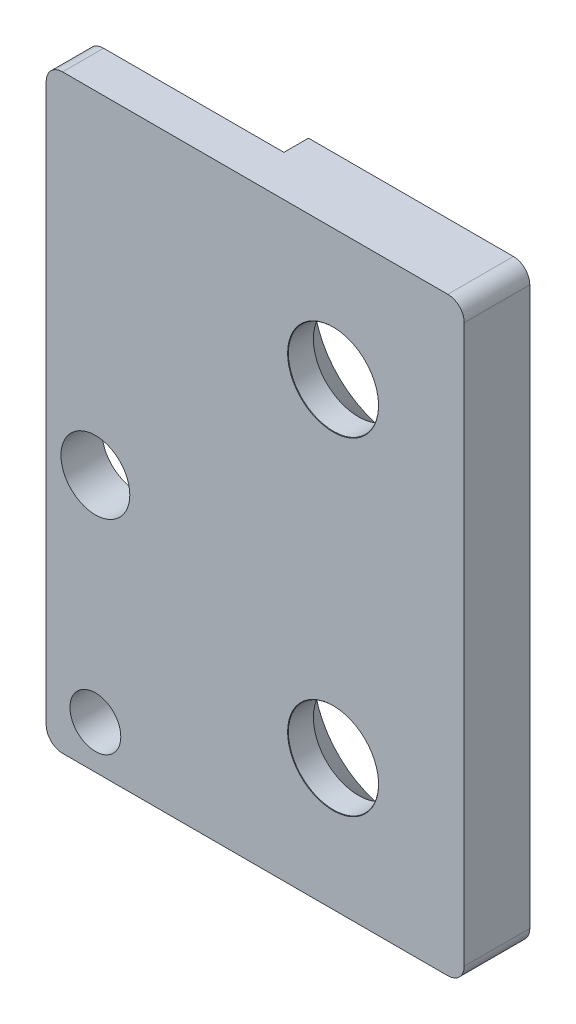
ISO-10303-21;
HEADER;
FILE_DESCRIPTION(('STEP AP214'),'2;1');
FILE_NAME('part.step','',(''),(''),'','','');
FILE_SCHEMA(('AUTOMOTIVE_DESIGN { 1 0 10303 214 1 1 1 1 }'));
ENDSEC;
DATA;
#1=APPLICATION_CONTEXT('core data for automotive mechanical design processes');
#2=APPLICATION_PROTOCOL_DEFINITION('international standard','automotive_design',2000,#1);
#3=PRODUCT_CONTEXT('',#1,'mechanical');
#4=PRODUCT('Part','Part','',(#3));
#5=PRODUCT_RELATED_PRODUCT_CATEGORY('part','',(#4));
#6=PRODUCT_DEFINITION_FORMATION('','',#4);
#7=PRODUCT_DEFINITION_CONTEXT('part definition',#1,'design');
#8=PRODUCT_DEFINITION('design','',#6,#7);
#9=PRODUCT_DEFINITION_SHAPE('','',#8);
#10=(LENGTH_UNIT() NAMED_UNIT(*) SI_UNIT(.MILLI.,.METRE.));
#11=(NAMED_UNIT(*) PLANE_ANGLE_UNIT() SI_UNIT($,.RADIAN.));
#12=(NAMED_UNIT(*) SI_UNIT($,.STERADIAN.) SOLID_ANGLE_UNIT());
#13=UNCERTAINTY_MEASURE_WITH_UNIT(LENGTH_MEASURE(1.E-05),#10,'distance_accuracy_value','');
#14=(GEOMETRIC_REPRESENTATION_CONTEXT(3) GLOBAL_UNCERTAINTY_ASSIGNED_CONTEXT((#13)) GLOBAL_UNIT_ASSIGNED_CONTEXT((#10,
#11,#12)) REPRESENTATION_CONTEXT('',''));
#15=CARTESIAN_POINT('',(0.,0.,0.));
#16=DIRECTION('',(0.,0.,1.));
#17=DIRECTION('',(1.,0.,0.));
#18=AXIS2_PLACEMENT_3D('',#15,#16,#17);
#19=CARTESIAN_POINT('',(-12.75,-18.001,1.5));
#20=DIRECTION('',(0.,0.,1.));
#21=DIRECTION('',(1.,0.,0.));
#22=AXIS2_PLACEMENT_3D('',#19,#20,#21);
#23=PLANE('',#22);
#24=CARTESIAN_POINT('',(-9.75,-2.30000000000001,1.5));
#25=DIRECTION('',(0.,0.,-1.));
#26=DIRECTION('',(-1.,0.,0.));
#27=AXIS2_PLACEMENT_3D('',#24,#25,#26);
#28=CIRCLE('',#27,2.10000000000001);
#29=CARTESIAN_POINT('',(-11.85,-2.30000000000001,1.5));
#30=VERTEX_POINT('',#29);
#31=EDGE_CURVE('E330',#30,#30,#28,.T.);
#32=ORIENTED_EDGE('',*,*,#31,.F.);
#33=EDGE_LOOP('',(#32));
#34=FACE_BOUND('',#33,.T.);
#35=DIRECTION('',(-1.,0.,0.));
#36=VECTOR('',#35,1.);
#37=CARTESIAN_POINT('',(-12.75,-18.,1.5));
#38=LINE('',#37,#36);
#39=CARTESIAN_POINT('',(-0.749999999999997,-18.,1.5));
#40=VERTEX_POINT('',#39);
#41=CARTESIAN_POINT('',(-11.75,-18.,1.5));
#42=VERTEX_POINT('',#41);
#43=EDGE_CURVE('E146',#40,#42,#38,.T.);
#44=ORIENTED_EDGE('',*,*,#43,.T.);
#45=CARTESIAN_POINT('',(-11.75,-17.,1.5));
#46=DIRECTION('',(0.,0.,1.));
#47=DIRECTION('',(1.,0.,0.));
#48=AXIS2_PLACEMENT_3D('',#45,#46,#47);
#49=CIRCLE('',#48,1.);
#50=CARTESIAN_POINT('',(-12.75,-17.,1.5));
#51=VERTEX_POINT('',#50);
#52=EDGE_CURVE('E173',#42,#51,#49,.F.);
#53=ORIENTED_EDGE('',*,*,#52,.T.);
#54=DIRECTION('',(0.,1.,0.));
#55=VECTOR('',#54,1.);
#56=CARTESIAN_POINT('',(-12.75,-18.001,1.5));
#57=LINE('',#56,#55);
#58=CARTESIAN_POINT('',(-12.75,17.,1.5));
#59=VERTEX_POINT('',#58);
#60=EDGE_CURVE('E137',#51,#59,#57,.T.);
#61=ORIENTED_EDGE('',*,*,#60,.T.);
#62=CARTESIAN_POINT('',(-11.75,17.,1.5));
#63=DIRECTION('',(0.,0.,1.));
#64=DIRECTION('',(1.,0.,0.));
#65=AXIS2_PLACEMENT_3D('',#62,#63,#64);
#66=CIRCLE('',#65,1.);
#67=CARTESIAN_POINT('',(-11.75,18.,1.5));
#68=VERTEX_POINT('',#67);
#69=EDGE_CURVE('E123',#59,#68,#66,.F.);
#70=ORIENTED_EDGE('',*,*,#69,.T.);
#71=DIRECTION('',(1.,0.,0.));
#72=VECTOR('',#71,1.);
#73=CARTESIAN_POINT('',(-12.75,18.,1.5));
#74=LINE('',#73,#72);
#75=CARTESIAN_POINT('',(-0.749999999999997,18.,1.5));
#76=VERTEX_POINT('',#75);
#77=EDGE_CURVE('E116',#68,#76,#74,.T.);
#78=ORIENTED_EDGE('',*,*,#77,.T.);
#79=DIRECTION('',(0.,1.,0.));
#80=VECTOR('',#79,1.);
#81=CARTESIAN_POINT('',(-0.749999999999997,-18.001,1.5));
#82=LINE('',#81,#80);
#83=EDGE_CURVE('E120',#40,#76,#82,.T.);
#84=ORIENTED_EDGE('',*,*,#83,.F.);
#85=EDGE_LOOP('',(#44,#53,#61,#70,#78,#84));
#86=FACE_BOUND('',#85,.T.);
#87=CARTESIAN_POINT('',(-9.75,-15.35,1.5));
#88=DIRECTION('',(0.,0.,-1.));
#89=DIRECTION('',(-1.,0.,0.));
#90=AXIS2_PLACEMENT_3D('',#87,#88,#89);
#91=CIRCLE('',#90,1.55);
#92=CARTESIAN_POINT('',(-11.3,-15.35,1.5));
#93=VERTEX_POINT('',#92);
#94=EDGE_CURVE('E324',#93,#93,#91,.T.);
#95=ORIENTED_EDGE('',*,*,#94,.F.);
#96=EDGE_LOOP('',(#95));
#97=FACE_BOUND('',#96,.T.);
#98=ADVANCED_FACE('F39',(#34,#86,#97),#23,.F.);
#99=CARTESIAN_POINT('',(0.,0.,0.));
#100=DIRECTION('',(0.,0.,1.));
#101=DIRECTION('',(1.,0.,0.));
#102=AXIS2_PLACEMENT_3D('',#99,#100,#101);
#103=PLANE('',#102);
#104=DIRECTION('',(-1.,0.,0.));
#105=VECTOR('',#104,1.);
#106=CARTESIAN_POINT('',(12.75,18.,0.));
#107=LINE('',#106,#105);
#108=CARTESIAN_POINT('',(11.75,18.,0.));
#109=VERTEX_POINT('',#108);
#110=CARTESIAN_POINT('',(-0.749999999999997,18.,0.));
#111=VERTEX_POINT('',#110);
#112=EDGE_CURVE('E141',#109,#111,#107,.T.);
#113=ORIENTED_EDGE('',*,*,#112,.F.);
#114=CARTESIAN_POINT('',(11.75,17.,0.));
#115=DIRECTION('',(0.,0.,1.));
#116=DIRECTION('',(1.,0.,0.));
#117=AXIS2_PLACEMENT_3D('',#114,#115,#116);
#118=CIRCLE('',#117,1.);
#119=CARTESIAN_POINT('',(12.75,17.,0.));
#120=VERTEX_POINT('',#119);
#121=EDGE_CURVE('E54',#109,#120,#118,.F.);
#122=ORIENTED_EDGE('',*,*,#121,.T.);
#123=DIRECTION('',(0.,1.,0.));
#124=VECTOR('',#123,1.);
#125=CARTESIAN_POINT('',(12.75,-18.,0.));
#126=LINE('',#125,#124);
#127=CARTESIAN_POINT('',(12.75,-17.,0.));
#128=VERTEX_POINT('',#127);
#129=EDGE_CURVE('E165',#128,#120,#126,.T.);
#130=ORIENTED_EDGE('',*,*,#129,.F.);
#131=CARTESIAN_POINT('',(11.75,-17.,0.));
#132=DIRECTION('',(0.,0.,1.));
#133=DIRECTION('',(1.,0.,0.));
#134=AXIS2_PLACEMENT_3D('',#131,#132,#133);
#135=CIRCLE('',#134,1.);
#136=CARTESIAN_POINT('',(11.75,-18.,0.));
#137=VERTEX_POINT('',#136);
#138=EDGE_CURVE('E62',#128,#137,#135,.F.);
#139=ORIENTED_EDGE('',*,*,#138,.T.);
#140=DIRECTION('',(1.,0.,0.));
#141=VECTOR('',#140,1.);
#142=CARTESIAN_POINT('',(12.75,-18.,0.));
#143=LINE('',#142,#141);
#144=CARTESIAN_POINT('',(-0.749999999999997,-18.,0.));
#145=VERTEX_POINT('',#144);
#146=EDGE_CURVE('E149',#145,#137,#143,.T.);
#147=ORIENTED_EDGE('',*,*,#146,.F.);
#148=DIRECTION('',(0.,1.,0.));
#149=VECTOR('',#148,1.);
#150=CARTESIAN_POINT('',(-0.749999999999997,-18.001,0.));
#151=LINE('',#150,#149);
#152=EDGE_CURVE('E136',#145,#111,#151,.T.);
#153=ORIENTED_EDGE('',*,*,#152,.T.);
#154=EDGE_LOOP('',(#113,#122,#130,#139,#147,#153));
#155=FACE_BOUND('',#154,.T.);
#156=CARTESIAN_POINT('',(4.75,-10.,0.));
#157=DIRECTION('',(0.,0.,-1.));
#158=DIRECTION('',(-1.,0.,0.));
#159=AXIS2_PLACEMENT_3D('',#156,#157,#158);
#160=CIRCLE('',#159,5.2);
#161=CARTESIAN_POINT('',(-0.449999999999999,-10.,0.));
#162=VERTEX_POINT('',#161);
#163=EDGE_CURVE('E303',#162,#162,#160,.T.);
#164=ORIENTED_EDGE('',*,*,#163,.F.);
#165=EDGE_LOOP('',(#164));
#166=FACE_BOUND('',#165,.T.);
#167=CARTESIAN_POINT('',(4.75,10.,0.));
#168=DIRECTION('',(0.,0.,-1.));
#169=DIRECTION('',(-1.,0.,0.));
#170=AXIS2_PLACEMENT_3D('',#167,#168,#169);
#171=CIRCLE('',#170,5.2);
#172=CARTESIAN_POINT('',(-0.449999999999999,10.,0.));
#173=VERTEX_POINT('',#172);
#174=EDGE_CURVE('E315',#173,#173,#171,.T.);
#175=ORIENTED_EDGE('',*,*,#174,.F.);
#176=EDGE_LOOP('',(#175));
#177=FACE_BOUND('',#176,.T.);
#178=ADVANCED_FACE('F198',(#155,#166,#177),#103,.F.);
#179=CARTESIAN_POINT('',(-12.75,-18.,4.));
#180=DIRECTION('',(1.,0.,0.));
#181=DIRECTION('',(0.,0.,-1.));
#182=AXIS2_PLACEMENT_3D('',#179,#180,#181);
#183=PLANE('',#182);
#184=ORIENTED_EDGE('',*,*,#60,.F.);
#185=DIRECTION('',(0.,0.,-1.));
#186=VECTOR('',#185,1.);
#187=CARTESIAN_POINT('',(-12.75,-17.,4.));
#188=LINE('',#187,#186);
#189=CARTESIAN_POINT('',(-12.75,-17.,4.));
#190=VERTEX_POINT('',#189);
#191=EDGE_CURVE('E178',#51,#190,#188,.F.);
#192=ORIENTED_EDGE('',*,*,#191,.T.);
#193=DIRECTION('',(0.,-1.,0.));
#194=VECTOR('',#193,1.);
#195=CARTESIAN_POINT('',(-12.75,-18.,4.));
#196=LINE('',#195,#194);
#197=CARTESIAN_POINT('',(-12.75,17.,4.));
#198=VERTEX_POINT('',#197);
#199=EDGE_CURVE('E150',#198,#190,#196,.T.);
#200=ORIENTED_EDGE('',*,*,#199,.F.);
#201=DIRECTION('',(0.,0.,-1.));
#202=VECTOR('',#201,1.);
#203=CARTESIAN_POINT('',(-12.75,17.,4.));
#204=LINE('',#203,#202);
#205=EDGE_CURVE('E175',#198,#59,#204,.T.);
#206=ORIENTED_EDGE('',*,*,#205,.T.);
#207=EDGE_LOOP('',(#184,#192,#200,#206));
#208=FACE_BOUND('',#207,.T.);
#209=ADVANCED_FACE('F214',(#208),#183,.F.);
#210=CARTESIAN_POINT('',(12.75,-18.,4.));
#211=DIRECTION('',(0.,1.,0.));
#212=DIRECTION('',(-1.,0.,0.));
#213=AXIS2_PLACEMENT_3D('',#210,#211,#212);
#214=PLANE('',#213);
#215=DIRECTION('',(1.,0.,0.));
#216=VECTOR('',#215,1.);
#217=CARTESIAN_POINT('',(12.75,-18.,4.));
#218=LINE('',#217,#216);
#219=CARTESIAN_POINT('',(-11.75,-18.,4.));
#220=VERTEX_POINT('',#219);
#221=CARTESIAN_POINT('',(11.75,-18.,4.));
#222=VERTEX_POINT('',#221);
#223=EDGE_CURVE('E153',#220,#222,#218,.T.);
#224=ORIENTED_EDGE('',*,*,#223,.F.);
#225=DIRECTION('',(0.,0.,-1.));
#226=VECTOR('',#225,1.);
#227=CARTESIAN_POINT('',(-11.75,-18.,4.));
#228=LINE('',#227,#226);
#229=EDGE_CURVE('E169',#220,#42,#228,.T.);
#230=ORIENTED_EDGE('',*,*,#229,.T.);
#231=ORIENTED_EDGE('',*,*,#43,.F.);
#232=DIRECTION('',(0.,0.,1.));
#233=VECTOR('',#232,1.);
#234=CARTESIAN_POINT('',(-0.749999999999997,-18.,0.));
#235=LINE('',#234,#233);
#236=EDGE_CURVE('E128',#145,#40,#235,.T.);
#237=ORIENTED_EDGE('',*,*,#236,.F.);
#238=ORIENTED_EDGE('',*,*,#146,.T.);
#239=DIRECTION('',(0.,0.,-1.));
#240=VECTOR('',#239,1.);
#241=CARTESIAN_POINT('',(11.75,-18.,4.));
#242=LINE('',#241,#240);
#243=EDGE_CURVE('E162',#137,#222,#242,.F.);
#244=ORIENTED_EDGE('',*,*,#243,.T.);
#245=EDGE_LOOP('',(#224,#230,#231,#237,#238,#244));
#246=FACE_BOUND('',#245,.T.);
#247=ADVANCED_FACE('F203',(#246),#214,.F.);
#248=CARTESIAN_POINT('',(12.75,-18.,4.));
#249=DIRECTION('',(-1.,0.,0.));
#250=DIRECTION('',(0.,0.,1.));
#251=AXIS2_PLACEMENT_3D('',#248,#249,#250);
#252=PLANE('',#251);
#253=ORIENTED_EDGE('',*,*,#129,.T.);
#254=DIRECTION('',(0.,0.,-1.));
#255=VECTOR('',#254,1.);
#256=CARTESIAN_POINT('',(12.75,17.,4.));
#257=LINE('',#256,#255);
#258=CARTESIAN_POINT('',(12.75,17.,4.));
#259=VERTEX_POINT('',#258);
#260=EDGE_CURVE('E11',#120,#259,#257,.F.);
#261=ORIENTED_EDGE('',*,*,#260,.T.);
#262=DIRECTION('',(0.,1.,0.));
#263=VECTOR('',#262,1.);
#264=CARTESIAN_POINT('',(12.75,-18.,4.));
#265=LINE('',#264,#263);
#266=CARTESIAN_POINT('',(12.75,-17.,4.));
#267=VERTEX_POINT('',#266);
#268=EDGE_CURVE('E156',#267,#259,#265,.T.);
#269=ORIENTED_EDGE('',*,*,#268,.F.);
#270=DIRECTION('',(0.,0.,-1.));
#271=VECTOR('',#270,1.);
#272=CARTESIAN_POINT('',(12.75,-17.,4.));
#273=LINE('',#272,#271);
#274=EDGE_CURVE('E47',#267,#128,#273,.T.);
#275=ORIENTED_EDGE('',*,*,#274,.T.);
#276=EDGE_LOOP('',(#253,#261,#269,#275));
#277=FACE_BOUND('',#276,.T.);
#278=ADVANCED_FACE('F195',(#277),#252,.F.);
#279=CARTESIAN_POINT('',(12.75,18.,4.));
#280=DIRECTION('',(0.,-1.,0.));
#281=DIRECTION('',(0.,0.,-1.));
#282=AXIS2_PLACEMENT_3D('',#279,#280,#281);
#283=PLANE('',#282);
#284=ORIENTED_EDGE('',*,*,#77,.F.);
#285=DIRECTION('',(0.,0.,-1.));
#286=VECTOR('',#285,1.);
#287=CARTESIAN_POINT('',(-11.75,18.,4.));
#288=LINE('',#287,#286);
#289=CARTESIAN_POINT('',(-11.75,18.,4.));
#290=VERTEX_POINT('',#289);
#291=EDGE_CURVE('E190',#68,#290,#288,.F.);
#292=ORIENTED_EDGE('',*,*,#291,.T.);
#293=DIRECTION('',(-1.,0.,0.));
#294=VECTOR('',#293,1.);
#295=CARTESIAN_POINT('',(12.75,18.,4.));
#296=LINE('',#295,#294);
#297=CARTESIAN_POINT('',(11.75,18.,4.));
#298=VERTEX_POINT('',#297);
#299=EDGE_CURVE('E159',#298,#290,#296,.T.);
#300=ORIENTED_EDGE('',*,*,#299,.F.);
#301=DIRECTION('',(0.,0.,-1.));
#302=VECTOR('',#301,1.);
#303=CARTESIAN_POINT('',(11.75,18.,4.));
#304=LINE('',#303,#302);
#305=EDGE_CURVE('E188',#298,#109,#304,.T.);
#306=ORIENTED_EDGE('',*,*,#305,.T.);
#307=ORIENTED_EDGE('',*,*,#112,.T.);
#308=DIRECTION('',(0.,0.,-1.));
#309=VECTOR('',#308,1.);
#310=CARTESIAN_POINT('',(-0.749999999999997,18.,0.));
#311=LINE('',#310,#309);
#312=EDGE_CURVE('E127',#76,#111,#311,.T.);
#313=ORIENTED_EDGE('',*,*,#312,.F.);
#314=EDGE_LOOP('',(#284,#292,#300,#306,#307,#313));
#315=FACE_BOUND('',#314,.T.);
#316=ADVANCED_FACE('F139',(#315),#283,.F.);
#317=CARTESIAN_POINT('',(0.,0.,4.));
#318=DIRECTION('',(0.,0.,1.));
#319=DIRECTION('',(1.,0.,0.));
#320=AXIS2_PLACEMENT_3D('',#317,#318,#319);
#321=PLANE('',#320);
#322=CARTESIAN_POINT('',(-9.75,-2.30000000000001,4.));
#323=DIRECTION('',(0.,0.,1.));
#324=DIRECTION('',(1.,0.,0.));
#325=AXIS2_PLACEMENT_3D('',#322,#323,#324);
#326=CIRCLE('',#325,2.10000000000001);
#327=CARTESIAN_POINT('',(-7.64999999999999,-2.30000000000001,4.));
#328=VERTEX_POINT('',#327);
#329=EDGE_CURVE('E327',#328,#328,#326,.T.);
#330=ORIENTED_EDGE('',*,*,#329,.F.);
#331=EDGE_LOOP('',(#330));
#332=FACE_BOUND('',#331,.T.);
#333=CARTESIAN_POINT('',(-9.75,-15.35,4.));
#334=DIRECTION('',(0.,0.,1.));
#335=DIRECTION('',(1.,0.,0.));
#336=AXIS2_PLACEMENT_3D('',#333,#334,#335);
#337=CIRCLE('',#336,1.55);
#338=CARTESIAN_POINT('',(-8.2,-15.35,4.));
#339=VERTEX_POINT('',#338);
#340=EDGE_CURVE('E321',#339,#339,#337,.T.);
#341=ORIENTED_EDGE('',*,*,#340,.F.);
#342=EDGE_LOOP('',(#341));
#343=FACE_BOUND('',#342,.T.);
#344=CARTESIAN_POINT('',(4.75,10.,4.));
#345=DIRECTION('',(0.,0.,-1.));
#346=DIRECTION('',(-1.,0.,0.));
#347=AXIS2_PLACEMENT_3D('',#344,#345,#346);
#348=CIRCLE('',#347,2.775);
#349=CARTESIAN_POINT('',(1.975,10.,4.));
#350=VERTEX_POINT('',#349);
#351=EDGE_CURVE('E318',#350,#350,#348,.T.);
#352=ORIENTED_EDGE('',*,*,#351,.T.);
#353=EDGE_LOOP('',(#352));
#354=FACE_BOUND('',#353,.T.);
#355=CARTESIAN_POINT('',(4.75,-10.,4.));
#356=DIRECTION('',(0.,0.,-1.));
#357=DIRECTION('',(-1.,0.,0.));
#358=AXIS2_PLACEMENT_3D('',#355,#356,#357);
#359=CIRCLE('',#358,2.775);
#360=CARTESIAN_POINT('',(1.975,-10.,4.));
#361=VERTEX_POINT('',#360);
#362=EDGE_CURVE('E296',#361,#361,#359,.T.);
#363=ORIENTED_EDGE('',*,*,#362,.T.);
#364=EDGE_LOOP('',(#363));
#365=FACE_BOUND('',#364,.T.);
#366=ORIENTED_EDGE('',*,*,#199,.T.);
#367=CARTESIAN_POINT('',(-11.75,-17.,4.));
#368=DIRECTION('',(0.,0.,1.));
#369=DIRECTION('',(1.,0.,0.));
#370=AXIS2_PLACEMENT_3D('',#367,#368,#369);
#371=CIRCLE('',#370,1.);
#372=EDGE_CURVE('E186',#190,#220,#371,.T.);
#373=ORIENTED_EDGE('',*,*,#372,.T.);
#374=ORIENTED_EDGE('',*,*,#223,.T.);
#375=CARTESIAN_POINT('',(11.75,-17.,4.));
#376=DIRECTION('',(0.,0.,1.));
#377=DIRECTION('',(1.,0.,0.));
#378=AXIS2_PLACEMENT_3D('',#375,#376,#377);
#379=CIRCLE('',#378,1.);
#380=EDGE_CURVE('E180',#222,#267,#379,.T.);
#381=ORIENTED_EDGE('',*,*,#380,.T.);
#382=ORIENTED_EDGE('',*,*,#268,.T.);
#383=CARTESIAN_POINT('',(11.75,17.,4.));
#384=DIRECTION('',(0.,0.,1.));
#385=DIRECTION('',(1.,0.,0.));
#386=AXIS2_PLACEMENT_3D('',#383,#384,#385);
#387=CIRCLE('',#386,1.);
#388=EDGE_CURVE('E182',#259,#298,#387,.T.);
#389=ORIENTED_EDGE('',*,*,#388,.T.);
#390=ORIENTED_EDGE('',*,*,#299,.T.);
#391=CARTESIAN_POINT('',(-11.75,17.,4.));
#392=DIRECTION('',(0.,0.,1.));
#393=DIRECTION('',(1.,0.,0.));
#394=AXIS2_PLACEMENT_3D('',#391,#392,#393);
#395=CIRCLE('',#394,1.);
#396=EDGE_CURVE('E184',#290,#198,#395,.T.);
#397=ORIENTED_EDGE('',*,*,#396,.T.);
#398=EDGE_LOOP('',(#366,#373,#374,#381,#382,#389,#390,#397));
#399=FACE_BOUND('',#398,.T.);
#400=ADVANCED_FACE('F205',(#332,#343,#354,#365,#399),#321,.T.);
#401=CARTESIAN_POINT('',(-0.749999999999997,-18.001,0.));
#402=DIRECTION('',(1.,0.,0.));
#403=DIRECTION('',(0.,0.,-1.));
#404=AXIS2_PLACEMENT_3D('',#401,#402,#403);
#405=PLANE('',#404);
#406=ORIENTED_EDGE('',*,*,#236,.T.);
#407=ORIENTED_EDGE('',*,*,#83,.T.);
#408=ORIENTED_EDGE('',*,*,#312,.T.);
#409=ORIENTED_EDGE('',*,*,#152,.F.);
#410=EDGE_LOOP('',(#406,#407,#408,#409));
#411=FACE_BOUND('',#410,.T.);
#412=ADVANCED_FACE('F132',(#411),#405,.F.);
#413=CARTESIAN_POINT('',(4.75,-10.,3.975));
#414=DIRECTION('',(0.,0.,1.));
#415=DIRECTION('',(1.,0.,0.));
#416=AXIS2_PLACEMENT_3D('',#413,#414,#415);
#417=CONICAL_SURFACE('',#416,2.75,0.785398163397448);
#418=ORIENTED_EDGE('',*,*,#362,.F.);
#419=EDGE_LOOP('',(#418));
#420=FACE_BOUND('',#419,.T.);
#421=CARTESIAN_POINT('',(4.75,-10.,3.975));
#422=DIRECTION('',(0.,0.,-1.));
#423=DIRECTION('',(-1.,0.,0.));
#424=AXIS2_PLACEMENT_3D('',#421,#422,#423);
#425=CIRCLE('',#424,2.75);
#426=CARTESIAN_POINT('',(2.,-10.,3.975));
#427=VERTEX_POINT('',#426);
#428=EDGE_CURVE('E299',#427,#427,#425,.T.);
#429=ORIENTED_EDGE('',*,*,#428,.T.);
#430=EDGE_LOOP('',(#429));
#431=FACE_BOUND('',#430,.T.);
#432=ADVANCED_FACE('F286',(#420,#431),#417,.F.);
#433=CARTESIAN_POINT('',(4.75,-10.,0.));
#434=DIRECTION('',(0.,0.,-1.));
#435=DIRECTION('',(-1.,0.,0.));
#436=AXIS2_PLACEMENT_3D('',#433,#434,#435);
#437=CYLINDRICAL_SURFACE('',#436,2.75);
#438=ORIENTED_EDGE('',*,*,#428,.F.);
#439=EDGE_LOOP('',(#438));
#440=FACE_BOUND('',#439,.T.);
#441=CARTESIAN_POINT('',(4.75,-10.,2.45));
#442=DIRECTION('',(0.,0.,-1.));
#443=DIRECTION('',(-1.,0.,0.));
#444=AXIS2_PLACEMENT_3D('',#441,#442,#443);
#445=CIRCLE('',#444,2.75);
#446=CARTESIAN_POINT('',(2.,-10.,2.45));
#447=VERTEX_POINT('',#446);
#448=EDGE_CURVE('E300',#447,#447,#445,.T.);
#449=ORIENTED_EDGE('',*,*,#448,.T.);
#450=EDGE_LOOP('',(#449));
#451=FACE_BOUND('',#450,.T.);
#452=ADVANCED_FACE('F283',(#440,#451),#437,.F.);
#453=CARTESIAN_POINT('',(4.75,-10.,0.));
#454=DIRECTION('',(0.,0.,-1.));
#455=DIRECTION('',(-1.,0.,0.));
#456=AXIS2_PLACEMENT_3D('',#453,#454,#455);
#457=CONICAL_SURFACE('',#456,5.2,0.785398163397448);
#458=ORIENTED_EDGE('',*,*,#448,.F.);
#459=EDGE_LOOP('',(#458));
#460=FACE_BOUND('',#459,.T.);
#461=ORIENTED_EDGE('',*,*,#163,.T.);
#462=EDGE_LOOP('',(#461));
#463=FACE_BOUND('',#462,.T.);
#464=ADVANCED_FACE('F279',(#460,#463),#457,.F.);
#465=CARTESIAN_POINT('',(4.75,10.,3.975));
#466=DIRECTION('',(0.,0.,1.));
#467=DIRECTION('',(1.,0.,0.));
#468=AXIS2_PLACEMENT_3D('',#465,#466,#467);
#469=CONICAL_SURFACE('',#468,2.75,0.785398163397448);
#470=ORIENTED_EDGE('',*,*,#351,.F.);
#471=EDGE_LOOP('',(#470));
#472=FACE_BOUND('',#471,.T.);
#473=CARTESIAN_POINT('',(4.75,10.,3.975));
#474=DIRECTION('',(0.,0.,-1.));
#475=DIRECTION('',(-1.,0.,0.));
#476=AXIS2_PLACEMENT_3D('',#473,#474,#475);
#477=CIRCLE('',#476,2.75);
#478=CARTESIAN_POINT('',(2.,10.,3.975));
#479=VERTEX_POINT('',#478);
#480=EDGE_CURVE('E309',#479,#479,#477,.T.);
#481=ORIENTED_EDGE('',*,*,#480,.T.);
#482=EDGE_LOOP('',(#481));
#483=FACE_BOUND('',#482,.T.);
#484=ADVANCED_FACE('F275',(#472,#483),#469,.F.);
#485=CARTESIAN_POINT('',(4.75,10.,0.));
#486=DIRECTION('',(0.,0.,-1.));
#487=DIRECTION('',(-1.,0.,0.));
#488=AXIS2_PLACEMENT_3D('',#485,#486,#487);
#489=CYLINDRICAL_SURFACE('',#488,2.75);
#490=ORIENTED_EDGE('',*,*,#480,.F.);
#491=EDGE_LOOP('',(#490));
#492=FACE_BOUND('',#491,.T.);
#493=CARTESIAN_POINT('',(4.75,10.,2.45));
#494=DIRECTION('',(0.,0.,-1.));
#495=DIRECTION('',(-1.,0.,0.));
#496=AXIS2_PLACEMENT_3D('',#493,#494,#495);
#497=CIRCLE('',#496,2.75);
#498=CARTESIAN_POINT('',(2.,10.,2.45));
#499=VERTEX_POINT('',#498);
#500=EDGE_CURVE('E312',#499,#499,#497,.T.);
#501=ORIENTED_EDGE('',*,*,#500,.T.);
#502=EDGE_LOOP('',(#501));
#503=FACE_BOUND('',#502,.T.);
#504=ADVANCED_FACE('F271',(#492,#503),#489,.F.);
#505=CARTESIAN_POINT('',(4.75,10.,0.));
#506=DIRECTION('',(0.,0.,-1.));
#507=DIRECTION('',(-1.,0.,0.));
#508=AXIS2_PLACEMENT_3D('',#505,#506,#507);
#509=CONICAL_SURFACE('',#508,5.2,0.785398163397448);
#510=ORIENTED_EDGE('',*,*,#500,.F.);
#511=EDGE_LOOP('',(#510));
#512=FACE_BOUND('',#511,.T.);
#513=ORIENTED_EDGE('',*,*,#174,.T.);
#514=EDGE_LOOP('',(#513));
#515=FACE_BOUND('',#514,.T.);
#516=ADVANCED_FACE('F263',(#512,#515),#509,.F.);
#517=CARTESIAN_POINT('',(-9.75,-15.35,1.5));
#518=DIRECTION('',(0.,0.,-1.));
#519=DIRECTION('',(-1.,0.,0.));
#520=AXIS2_PLACEMENT_3D('',#517,#518,#519);
#521=CYLINDRICAL_SURFACE('',#520,1.55);
#522=ORIENTED_EDGE('',*,*,#94,.T.);
#523=EDGE_LOOP('',(#522));
#524=FACE_BOUND('',#523,.T.);
#525=ORIENTED_EDGE('',*,*,#340,.T.);
#526=EDGE_LOOP('',(#525));
#527=FACE_BOUND('',#526,.T.);
#528=ADVANCED_FACE('F257',(#524,#527),#521,.F.);
#529=CARTESIAN_POINT('',(-9.75,-2.30000000000001,1.5));
#530=DIRECTION('',(0.,0.,-1.));
#531=DIRECTION('',(-1.,0.,0.));
#532=AXIS2_PLACEMENT_3D('',#529,#530,#531);
#533=CYLINDRICAL_SURFACE('',#532,2.10000000000001);
#534=ORIENTED_EDGE('',*,*,#31,.T.);
#535=EDGE_LOOP('',(#534));
#536=FACE_BOUND('',#535,.T.);
#537=ORIENTED_EDGE('',*,*,#329,.T.);
#538=EDGE_LOOP('',(#537));
#539=FACE_BOUND('',#538,.T.);
#540=ADVANCED_FACE('F253',(#536,#539),#533,.F.);
#541=CARTESIAN_POINT('',(-11.75,-17.,4.));
#542=DIRECTION('',(0.,0.,-1.));
#543=DIRECTION('',(-1.,0.,0.));
#544=AXIS2_PLACEMENT_3D('',#541,#542,#543);
#545=CYLINDRICAL_SURFACE('',#544,1.);
#546=ORIENTED_EDGE('',*,*,#372,.F.);
#547=ORIENTED_EDGE('',*,*,#191,.F.);
#548=ORIENTED_EDGE('',*,*,#52,.F.);
#549=ORIENTED_EDGE('',*,*,#229,.F.);
#550=EDGE_LOOP('',(#546,#547,#548,#549));
#551=FACE_BOUND('',#550,.T.);
#552=ADVANCED_FACE('F210',(#551),#545,.T.);
#553=CARTESIAN_POINT('',(-11.75,17.,4.));
#554=DIRECTION('',(0.,0.,-1.));
#555=DIRECTION('',(-1.,0.,0.));
#556=AXIS2_PLACEMENT_3D('',#553,#554,#555);
#557=CYLINDRICAL_SURFACE('',#556,1.);
#558=ORIENTED_EDGE('',*,*,#396,.F.);
#559=ORIENTED_EDGE('',*,*,#291,.F.);
#560=ORIENTED_EDGE('',*,*,#69,.F.);
#561=ORIENTED_EDGE('',*,*,#205,.F.);
#562=EDGE_LOOP('',(#558,#559,#560,#561));
#563=FACE_BOUND('',#562,.T.);
#564=ADVANCED_FACE('F219',(#563),#557,.T.);
#565=CARTESIAN_POINT('',(11.75,17.,4.));
#566=DIRECTION('',(0.,0.,-1.));
#567=DIRECTION('',(-1.,0.,0.));
#568=AXIS2_PLACEMENT_3D('',#565,#566,#567);
#569=CYLINDRICAL_SURFACE('',#568,1.);
#570=ORIENTED_EDGE('',*,*,#388,.F.);
#571=ORIENTED_EDGE('',*,*,#260,.F.);
#572=ORIENTED_EDGE('',*,*,#121,.F.);
#573=ORIENTED_EDGE('',*,*,#305,.F.);
#574=EDGE_LOOP('',(#570,#571,#572,#573));
#575=FACE_BOUND('',#574,.T.);
#576=ADVANCED_FACE('F223',(#575),#569,.T.);
#577=CARTESIAN_POINT('',(11.75,-17.,4.));
#578=DIRECTION('',(0.,0.,-1.));
#579=DIRECTION('',(-1.,0.,0.));
#580=AXIS2_PLACEMENT_3D('',#577,#578,#579);
#581=CYLINDRICAL_SURFACE('',#580,1.);
#582=ORIENTED_EDGE('',*,*,#380,.F.);
#583=ORIENTED_EDGE('',*,*,#243,.F.);
#584=ORIENTED_EDGE('',*,*,#138,.F.);
#585=ORIENTED_EDGE('',*,*,#274,.F.);
#586=EDGE_LOOP('',(#582,#583,#584,#585));
#587=FACE_BOUND('',#586,.T.);
#588=ADVANCED_FACE('F41',(#587),#581,.T.);
#589=CLOSED_SHELL('',(#98,#178,#209,#247,#278,#316,#400,#412,#432,#452,#464,#484,#504,#516,#528,
#540,#552,#564,#576,#588));
#590=MANIFOLD_SOLID_BREP('B2',#589);
#591=ADVANCED_BREP_SHAPE_REPRESENTATION('',(#18,#590),#14);
#592=SHAPE_DEFINITION_REPRESENTATION(#9,#591);
ENDSEC;
END-ISO-10303-21;
